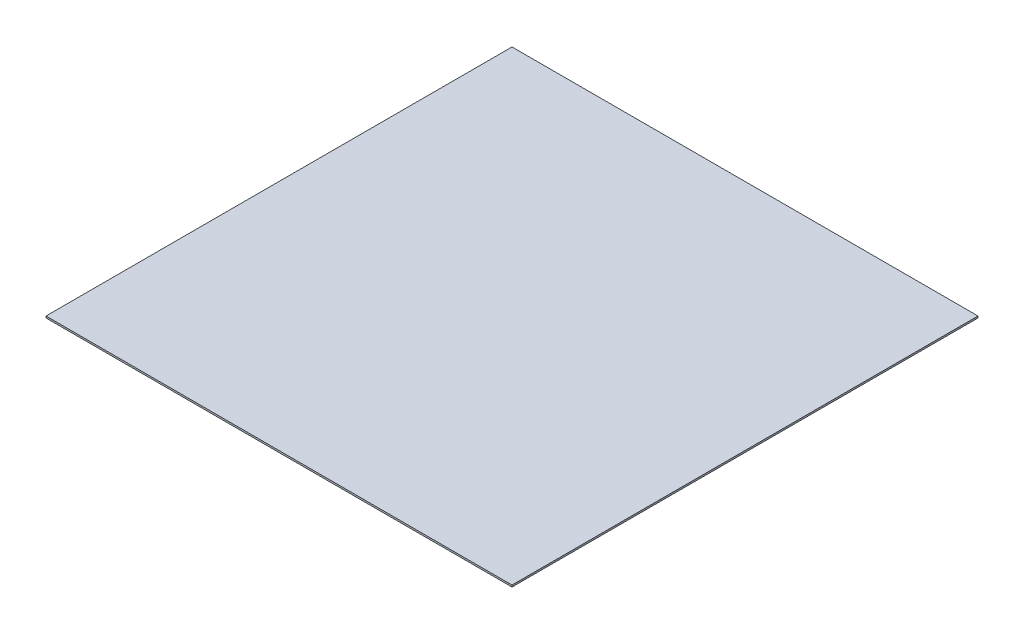
ISO-10303-21;
HEADER;
FILE_DESCRIPTION(('STEP AP214'),'2;1');
FILE_NAME('part.step','',(''),(''),'','','');
FILE_SCHEMA(('AUTOMOTIVE_DESIGN { 1 0 10303 214 1 1 1 1 }'));
ENDSEC;
DATA;
#1=APPLICATION_CONTEXT('core data for automotive mechanical design processes');
#2=APPLICATION_PROTOCOL_DEFINITION('international standard','automotive_design',2000,#1);
#3=PRODUCT_CONTEXT('',#1,'mechanical');
#4=PRODUCT('Part','Part','',(#3));
#5=PRODUCT_RELATED_PRODUCT_CATEGORY('part','',(#4));
#6=PRODUCT_DEFINITION_FORMATION('','',#4);
#7=PRODUCT_DEFINITION_CONTEXT('part definition',#1,'design');
#8=PRODUCT_DEFINITION('design','',#6,#7);
#9=PRODUCT_DEFINITION_SHAPE('','',#8);
#10=(LENGTH_UNIT() NAMED_UNIT(*) SI_UNIT(.MILLI.,.METRE.));
#11=(NAMED_UNIT(*) PLANE_ANGLE_UNIT() SI_UNIT($,.RADIAN.));
#12=(NAMED_UNIT(*) SI_UNIT($,.STERADIAN.) SOLID_ANGLE_UNIT());
#13=UNCERTAINTY_MEASURE_WITH_UNIT(LENGTH_MEASURE(1.E-05),#10,'distance_accuracy_value','');
#14=(GEOMETRIC_REPRESENTATION_CONTEXT(3) GLOBAL_UNCERTAINTY_ASSIGNED_CONTEXT((#13)) GLOBAL_UNIT_ASSIGNED_CONTEXT((#10,
#11,#12)) REPRESENTATION_CONTEXT('',''));
#15=CARTESIAN_POINT('',(0.,0.,0.));
#16=DIRECTION('',(0.,0.,1.));
#17=DIRECTION('',(1.,0.,0.));
#18=AXIS2_PLACEMENT_3D('',#15,#16,#17);
#19=CARTESIAN_POINT('',(-400.,3.,-400.));
#20=DIRECTION('',(1.,0.,0.));
#21=DIRECTION('',(0.,0.,-1.));
#22=AXIS2_PLACEMENT_3D('',#19,#20,#21);
#23=PLANE('',#22);
#24=DIRECTION('',(0.,0.,1.));
#25=VECTOR('',#24,1.);
#26=CARTESIAN_POINT('',(-400.,0.,-400.));
#27=LINE('',#26,#25);
#28=CARTESIAN_POINT('',(-400.,0.,-400.));
#29=VERTEX_POINT('',#28);
#30=CARTESIAN_POINT('',(-400.,0.,400.));
#31=VERTEX_POINT('',#30);
#32=EDGE_CURVE('E105',#29,#31,#27,.T.);
#33=ORIENTED_EDGE('',*,*,#32,.T.);
#34=DIRECTION('',(0.,-1.,0.));
#35=VECTOR('',#34,1.);
#36=CARTESIAN_POINT('',(-400.,3.,400.));
#37=LINE('',#36,#35);
#38=CARTESIAN_POINT('',(-400.,3.,400.));
#39=VERTEX_POINT('',#38);
#40=EDGE_CURVE('E11',#39,#31,#37,.T.);
#41=ORIENTED_EDGE('',*,*,#40,.F.);
#42=DIRECTION('',(0.,0.,1.));
#43=VECTOR('',#42,1.);
#44=CARTESIAN_POINT('',(-400.,3.,-400.));
#45=LINE('',#44,#43);
#46=CARTESIAN_POINT('',(-400.,3.,-400.));
#47=VERTEX_POINT('',#46);
#48=EDGE_CURVE('E88',#47,#39,#45,.T.);
#49=ORIENTED_EDGE('',*,*,#48,.F.);
#50=DIRECTION('',(0.,-1.,0.));
#51=VECTOR('',#50,1.);
#52=CARTESIAN_POINT('',(-400.,3.,-400.));
#53=LINE('',#52,#51);
#54=EDGE_CURVE('E54',#47,#29,#53,.T.);
#55=ORIENTED_EDGE('',*,*,#54,.T.);
#56=EDGE_LOOP('',(#33,#41,#49,#55));
#57=FACE_BOUND('',#56,.T.);
#58=ADVANCED_FACE('F39',(#57),#23,.F.);
#59=CARTESIAN_POINT('',(-400.,3.,400.));
#60=DIRECTION('',(0.,0.,-1.));
#61=DIRECTION('',(-1.,0.,0.));
#62=AXIS2_PLACEMENT_3D('',#59,#60,#61);
#63=PLANE('',#62);
#64=DIRECTION('',(1.,0.,0.));
#65=VECTOR('',#64,1.);
#66=CARTESIAN_POINT('',(-400.,0.,400.));
#67=LINE('',#66,#65);
#68=CARTESIAN_POINT('',(400.,0.,400.));
#69=VERTEX_POINT('',#68);
#70=EDGE_CURVE('E93',#31,#69,#67,.T.);
#71=ORIENTED_EDGE('',*,*,#70,.T.);
#72=DIRECTION('',(0.,-1.,0.));
#73=VECTOR('',#72,1.);
#74=CARTESIAN_POINT('',(400.,3.,400.));
#75=LINE('',#74,#73);
#76=CARTESIAN_POINT('',(400.,3.,400.));
#77=VERTEX_POINT('',#76);
#78=EDGE_CURVE('E50',#77,#69,#75,.T.);
#79=ORIENTED_EDGE('',*,*,#78,.F.);
#80=DIRECTION('',(1.,0.,0.));
#81=VECTOR('',#80,1.);
#82=CARTESIAN_POINT('',(-400.,3.,400.));
#83=LINE('',#82,#81);
#84=EDGE_CURVE('E79',#39,#77,#83,.T.);
#85=ORIENTED_EDGE('',*,*,#84,.F.);
#86=ORIENTED_EDGE('',*,*,#40,.T.);
#87=EDGE_LOOP('',(#71,#79,#85,#86));
#88=FACE_BOUND('',#87,.T.);
#89=ADVANCED_FACE('F95',(#88),#63,.F.);
#90=CARTESIAN_POINT('',(400.,3.,-400.));
#91=DIRECTION('',(1.,0.,0.));
#92=DIRECTION('',(0.,0.,-1.));
#93=AXIS2_PLACEMENT_3D('',#90,#91,#92);
#94=PLANE('',#93);
#95=DIRECTION('',(0.,0.,1.));
#96=VECTOR('',#95,1.);
#97=CARTESIAN_POINT('',(400.,0.,-400.));
#98=LINE('',#97,#96);
#99=CARTESIAN_POINT('',(400.,0.,-400.));
#100=VERTEX_POINT('',#99);
#101=EDGE_CURVE('E103',#100,#69,#98,.T.);
#102=ORIENTED_EDGE('',*,*,#101,.F.);
#103=DIRECTION('',(0.,-1.,0.));
#104=VECTOR('',#103,1.);
#105=CARTESIAN_POINT('',(400.,3.,-400.));
#106=LINE('',#105,#104);
#107=CARTESIAN_POINT('',(400.,3.,-400.));
#108=VERTEX_POINT('',#107);
#109=EDGE_CURVE('E69',#108,#100,#106,.T.);
#110=ORIENTED_EDGE('',*,*,#109,.F.);
#111=DIRECTION('',(0.,0.,1.));
#112=VECTOR('',#111,1.);
#113=CARTESIAN_POINT('',(400.,3.,-400.));
#114=LINE('',#113,#112);
#115=EDGE_CURVE('E90',#108,#77,#114,.T.);
#116=ORIENTED_EDGE('',*,*,#115,.T.);
#117=ORIENTED_EDGE('',*,*,#78,.T.);
#118=EDGE_LOOP('',(#102,#110,#116,#117));
#119=FACE_BOUND('',#118,.T.);
#120=ADVANCED_FACE('F96',(#119),#94,.T.);
#121=CARTESIAN_POINT('',(-400.,3.,-400.));
#122=DIRECTION('',(0.,0.,-1.));
#123=DIRECTION('',(-1.,0.,0.));
#124=AXIS2_PLACEMENT_3D('',#121,#122,#123);
#125=PLANE('',#124);
#126=DIRECTION('',(1.,0.,0.));
#127=VECTOR('',#126,1.);
#128=CARTESIAN_POINT('',(-400.,0.,-400.));
#129=LINE('',#128,#127);
#130=EDGE_CURVE('E107',#29,#100,#129,.T.);
#131=ORIENTED_EDGE('',*,*,#130,.F.);
#132=ORIENTED_EDGE('',*,*,#54,.F.);
#133=DIRECTION('',(1.,0.,0.));
#134=VECTOR('',#133,1.);
#135=CARTESIAN_POINT('',(-400.,3.,-400.));
#136=LINE('',#135,#134);
#137=EDGE_CURVE('E100',#47,#108,#136,.T.);
#138=ORIENTED_EDGE('',*,*,#137,.T.);
#139=ORIENTED_EDGE('',*,*,#109,.T.);
#140=EDGE_LOOP('',(#131,#132,#138,#139));
#141=FACE_BOUND('',#140,.T.);
#142=ADVANCED_FACE('F111',(#141),#125,.T.);
#143=CARTESIAN_POINT('',(0.,3.,0.));
#144=DIRECTION('',(0.,1.,0.));
#145=DIRECTION('',(0.,0.,1.));
#146=AXIS2_PLACEMENT_3D('',#143,#144,#145);
#147=PLANE('',#146);
#148=ORIENTED_EDGE('',*,*,#48,.T.);
#149=ORIENTED_EDGE('',*,*,#84,.T.);
#150=ORIENTED_EDGE('',*,*,#115,.F.);
#151=ORIENTED_EDGE('',*,*,#137,.F.);
#152=EDGE_LOOP('',(#148,#149,#150,#151));
#153=FACE_BOUND('',#152,.T.);
#154=ADVANCED_FACE('F84',(#153),#147,.T.);
#155=CARTESIAN_POINT('',(0.,0.,0.));
#156=DIRECTION('',(0.,1.,0.));
#157=DIRECTION('',(0.,0.,1.));
#158=AXIS2_PLACEMENT_3D('',#155,#156,#157);
#159=PLANE('',#158);
#160=ORIENTED_EDGE('',*,*,#32,.F.);
#161=ORIENTED_EDGE('',*,*,#130,.T.);
#162=ORIENTED_EDGE('',*,*,#101,.T.);
#163=ORIENTED_EDGE('',*,*,#70,.F.);
#164=EDGE_LOOP('',(#160,#161,#162,#163));
#165=FACE_BOUND('',#164,.T.);
#166=ADVANCED_FACE('F115',(#165),#159,.F.);
#167=CLOSED_SHELL('',(#58,#89,#120,#142,#154,#166));
#168=MANIFOLD_SOLID_BREP('B2',#167);
#169=ADVANCED_BREP_SHAPE_REPRESENTATION('',(#18,#168),#14);
#170=SHAPE_DEFINITION_REPRESENTATION(#9,#169);
ENDSEC;
END-ISO-10303-21;
